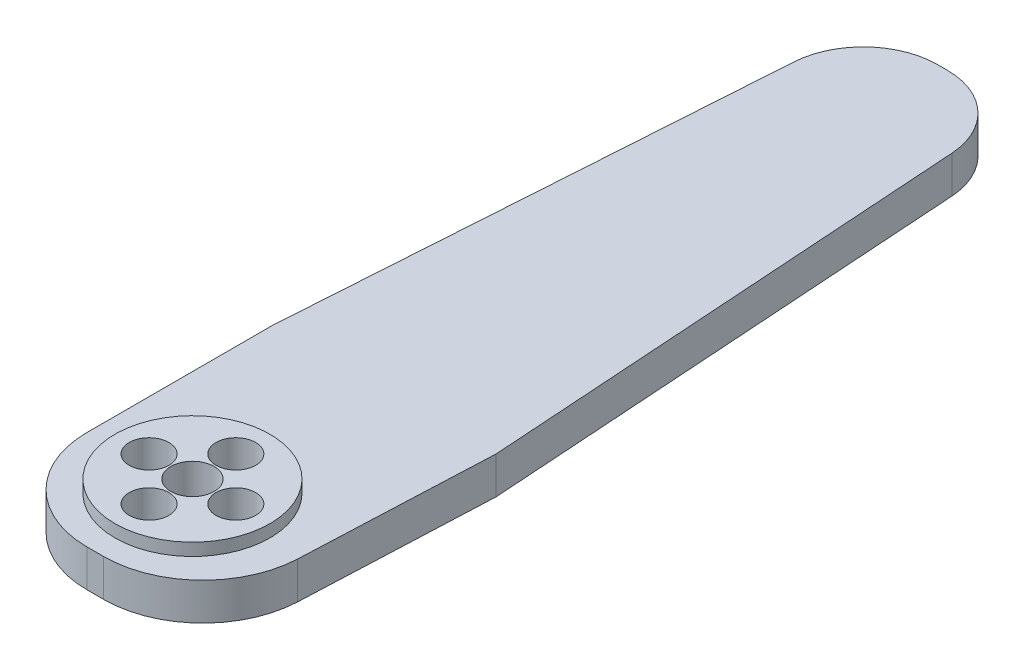
ISO-10303-21;
HEADER;
FILE_DESCRIPTION(('STEP AP214'),'2;1');
FILE_NAME('part.step','',(''),(''),'','','');
FILE_SCHEMA(('AUTOMOTIVE_DESIGN { 1 0 10303 214 1 1 1 1 }'));
ENDSEC;
DATA;
#1=APPLICATION_CONTEXT('core data for automotive mechanical design processes');
#2=APPLICATION_PROTOCOL_DEFINITION('international standard','automotive_design',2000,#1);
#3=PRODUCT_CONTEXT('',#1,'mechanical');
#4=PRODUCT('Part','Part','',(#3));
#5=PRODUCT_RELATED_PRODUCT_CATEGORY('part','',(#4));
#6=PRODUCT_DEFINITION_FORMATION('','',#4);
#7=PRODUCT_DEFINITION_CONTEXT('part definition',#1,'design');
#8=PRODUCT_DEFINITION('design','',#6,#7);
#9=PRODUCT_DEFINITION_SHAPE('','',#8);
#10=(LENGTH_UNIT() NAMED_UNIT(*) SI_UNIT(.MILLI.,.METRE.));
#11=(NAMED_UNIT(*) PLANE_ANGLE_UNIT() SI_UNIT($,.RADIAN.));
#12=(NAMED_UNIT(*) SI_UNIT($,.STERADIAN.) SOLID_ANGLE_UNIT());
#13=UNCERTAINTY_MEASURE_WITH_UNIT(LENGTH_MEASURE(1.E-05),#10,'distance_accuracy_value','');
#14=(GEOMETRIC_REPRESENTATION_CONTEXT(3) GLOBAL_UNCERTAINTY_ASSIGNED_CONTEXT((#13)) GLOBAL_UNIT_ASSIGNED_CONTEXT((#10,
#11,#12)) REPRESENTATION_CONTEXT('',''));
#15=CARTESIAN_POINT('',(0.,0.,0.));
#16=DIRECTION('',(0.,0.,1.));
#17=DIRECTION('',(1.,0.,0.));
#18=AXIS2_PLACEMENT_3D('',#15,#16,#17);
#19=CARTESIAN_POINT('',(0.,8.1,-7.));
#20=DIRECTION('',(0.,-1.,0.));
#21=DIRECTION('',(0.,0.,-1.));
#22=AXIS2_PLACEMENT_3D('',#19,#20,#21);
#23=CYLINDRICAL_SURFACE('',#22,1.7);
#24=CARTESIAN_POINT('',(0.,0.,-7.));
#25=DIRECTION('',(0.,1.,0.));
#26=DIRECTION('',(0.,0.,1.));
#27=AXIS2_PLACEMENT_3D('',#24,#25,#26);
#28=CIRCLE('',#27,1.7);
#29=CARTESIAN_POINT('',(0.,0.,-5.3));
#30=VERTEX_POINT('',#29);
#31=EDGE_CURVE('E205',#30,#30,#28,.F.);
#32=ORIENTED_EDGE('',*,*,#31,.T.);
#33=EDGE_LOOP('',(#32));
#34=FACE_BOUND('',#33,.T.);
#35=CARTESIAN_POINT('',(0.,3.,-7.));
#36=DIRECTION('',(0.,1.,0.));
#37=DIRECTION('',(0.,0.,1.));
#38=AXIS2_PLACEMENT_3D('',#35,#36,#37);
#39=CIRCLE('',#38,1.7);
#40=CARTESIAN_POINT('',(0.,3.,-5.3));
#41=VERTEX_POINT('',#40);
#42=EDGE_CURVE('E216',#41,#41,#39,.T.);
#43=ORIENTED_EDGE('',*,*,#42,.T.);
#44=EDGE_LOOP('',(#43));
#45=FACE_BOUND('',#44,.T.);
#46=ADVANCED_FACE('F39',(#34,#45),#23,.F.);
#47=CARTESIAN_POINT('',(-7.,8.1,0.));
#48=DIRECTION('',(0.,-1.,0.));
#49=DIRECTION('',(0.,0.,-1.));
#50=AXIS2_PLACEMENT_3D('',#47,#48,#49);
#51=CYLINDRICAL_SURFACE('',#50,1.7);
#52=CARTESIAN_POINT('',(-7.,0.,0.));
#53=DIRECTION('',(0.,1.,0.));
#54=DIRECTION('',(0.,0.,1.));
#55=AXIS2_PLACEMENT_3D('',#52,#53,#54);
#56=CIRCLE('',#55,1.7);
#57=CARTESIAN_POINT('',(-7.,0.,1.7));
#58=VERTEX_POINT('',#57);
#59=EDGE_CURVE('E231',#58,#58,#56,.F.);
#60=ORIENTED_EDGE('',*,*,#59,.T.);
#61=EDGE_LOOP('',(#60));
#62=FACE_BOUND('',#61,.T.);
#63=CARTESIAN_POINT('',(-7.,3.,0.));
#64=DIRECTION('',(0.,1.,0.));
#65=DIRECTION('',(0.,0.,1.));
#66=AXIS2_PLACEMENT_3D('',#63,#64,#65);
#67=CIRCLE('',#66,1.7);
#68=CARTESIAN_POINT('',(-7.,3.,1.7));
#69=VERTEX_POINT('',#68);
#70=EDGE_CURVE('E209',#69,#69,#67,.T.);
#71=ORIENTED_EDGE('',*,*,#70,.T.);
#72=EDGE_LOOP('',(#71));
#73=FACE_BOUND('',#72,.T.);
#74=ADVANCED_FACE('F281',(#62,#73),#51,.F.);
#75=CARTESIAN_POINT('',(0.,8.1,7.));
#76=DIRECTION('',(0.,-1.,0.));
#77=DIRECTION('',(0.,0.,-1.));
#78=AXIS2_PLACEMENT_3D('',#75,#76,#77);
#79=CYLINDRICAL_SURFACE('',#78,1.7);
#80=CARTESIAN_POINT('',(0.,0.,7.));
#81=DIRECTION('',(0.,1.,0.));
#82=DIRECTION('',(0.,0.,1.));
#83=AXIS2_PLACEMENT_3D('',#80,#81,#82);
#84=CIRCLE('',#83,1.7);
#85=CARTESIAN_POINT('',(0.,0.,8.7));
#86=VERTEX_POINT('',#85);
#87=EDGE_CURVE('E236',#86,#86,#84,.F.);
#88=ORIENTED_EDGE('',*,*,#87,.T.);
#89=EDGE_LOOP('',(#88));
#90=FACE_BOUND('',#89,.T.);
#91=CARTESIAN_POINT('',(0.,3.,7.));
#92=DIRECTION('',(0.,1.,0.));
#93=DIRECTION('',(0.,0.,1.));
#94=AXIS2_PLACEMENT_3D('',#91,#92,#93);
#95=CIRCLE('',#94,1.7);
#96=CARTESIAN_POINT('',(0.,3.,8.7));
#97=VERTEX_POINT('',#96);
#98=EDGE_CURVE('E201',#97,#97,#95,.T.);
#99=ORIENTED_EDGE('',*,*,#98,.T.);
#100=EDGE_LOOP('',(#99));
#101=FACE_BOUND('',#100,.T.);
#102=ADVANCED_FACE('F291',(#90,#101),#79,.F.);
#103=CARTESIAN_POINT('',(7.,8.1,0.));
#104=DIRECTION('',(0.,-1.,0.));
#105=DIRECTION('',(0.,0.,-1.));
#106=AXIS2_PLACEMENT_3D('',#103,#104,#105);
#107=CYLINDRICAL_SURFACE('',#106,1.7);
#108=CARTESIAN_POINT('',(7.,0.,0.));
#109=DIRECTION('',(0.,1.,0.));
#110=DIRECTION('',(0.,0.,1.));
#111=AXIS2_PLACEMENT_3D('',#108,#109,#110);
#112=CIRCLE('',#111,1.7);
#113=CARTESIAN_POINT('',(7.,0.,1.7));
#114=VERTEX_POINT('',#113);
#115=EDGE_CURVE('E194',#114,#114,#112,.F.);
#116=ORIENTED_EDGE('',*,*,#115,.T.);
#117=EDGE_LOOP('',(#116));
#118=FACE_BOUND('',#117,.T.);
#119=CARTESIAN_POINT('',(7.,3.,0.));
#120=DIRECTION('',(0.,1.,0.));
#121=DIRECTION('',(0.,0.,1.));
#122=AXIS2_PLACEMENT_3D('',#119,#120,#121);
#123=CIRCLE('',#122,1.7);
#124=CARTESIAN_POINT('',(7.,3.,1.7));
#125=VERTEX_POINT('',#124);
#126=EDGE_CURVE('E191',#125,#125,#123,.T.);
#127=ORIENTED_EDGE('',*,*,#126,.T.);
#128=EDGE_LOOP('',(#127));
#129=FACE_BOUND('',#128,.T.);
#130=ADVANCED_FACE('F305',(#118,#129),#107,.F.);
#131=CARTESIAN_POINT('',(-0.999970982587433,6.,-2.90174125647941E-05));
#132=DIRECTION('',(0.,-1.,0.));
#133=DIRECTION('',(0.,0.,-1.));
#134=AXIS2_PLACEMENT_3D('',#131,#132,#133);
#135=CYLINDRICAL_SURFACE('',#134,16.0000290174389);
#136=CARTESIAN_POINT('',(-0.999970982587433,0.,-2.90174125647941E-05));
#137=DIRECTION('',(0.,1.,0.));
#138=DIRECTION('',(0.,0.,1.));
#139=AXIS2_PLACEMENT_3D('',#136,#137,#138);
#140=CIRCLE('',#139,16.0000290174389);
#141=CARTESIAN_POINT('',(-17.,0.,0.));
#142=VERTEX_POINT('',#141);
#143=CARTESIAN_POINT('',(-1.,0.,16.));
#144=VERTEX_POINT('',#143);
#145=EDGE_CURVE('E151',#142,#144,#140,.T.);
#146=ORIENTED_EDGE('',*,*,#145,.T.);
#147=DIRECTION('',(0.,-1.,0.));
#148=VECTOR('',#147,1.);
#149=CARTESIAN_POINT('',(-1.,6.,16.));
#150=LINE('',#149,#148);
#151=CARTESIAN_POINT('',(-1.,6.,16.));
#152=VERTEX_POINT('',#151);
#153=EDGE_CURVE('E47',#152,#144,#150,.T.);
#154=ORIENTED_EDGE('',*,*,#153,.F.);
#155=CARTESIAN_POINT('',(-0.999970982587433,6.,-2.90174125647941E-05));
#156=DIRECTION('',(0.,1.,0.));
#157=DIRECTION('',(0.,0.,1.));
#158=AXIS2_PLACEMENT_3D('',#155,#156,#157);
#159=CIRCLE('',#158,16.0000290174389);
#160=CARTESIAN_POINT('',(-17.,6.,0.));
#161=VERTEX_POINT('',#160);
#162=EDGE_CURVE('E168',#161,#152,#159,.T.);
#163=ORIENTED_EDGE('',*,*,#162,.F.);
#164=DIRECTION('',(0.,-1.,0.));
#165=VECTOR('',#164,1.);
#166=CARTESIAN_POINT('',(-17.,6.,0.));
#167=LINE('',#166,#165);
#168=EDGE_CURVE('E150',#161,#142,#167,.T.);
#169=ORIENTED_EDGE('',*,*,#168,.T.);
#170=EDGE_LOOP('',(#146,#154,#163,#169));
#171=FACE_BOUND('',#170,.T.);
#172=ADVANCED_FACE('F41',(#171),#135,.T.);
#173=CARTESIAN_POINT('',(-1.,6.,16.));
#174=DIRECTION('',(0.,0.,-1.));
#175=DIRECTION('',(-1.,0.,0.));
#176=AXIS2_PLACEMENT_3D('',#173,#174,#175);
#177=PLANE('',#176);
#178=DIRECTION('',(1.,0.,0.));
#179=VECTOR('',#178,1.);
#180=CARTESIAN_POINT('',(-1.,0.,16.));
#181=LINE('',#180,#179);
#182=CARTESIAN_POINT('',(1.68049999999999,0.,16.));
#183=VERTEX_POINT('',#182);
#184=EDGE_CURVE('E152',#144,#183,#181,.T.);
#185=ORIENTED_EDGE('',*,*,#184,.T.);
#186=DIRECTION('',(0.,-1.,0.));
#187=VECTOR('',#186,1.);
#188=CARTESIAN_POINT('',(1.68049999999999,6.,16.));
#189=LINE('',#188,#187);
#190=CARTESIAN_POINT('',(1.68049999999999,6.,16.));
#191=VERTEX_POINT('',#190);
#192=EDGE_CURVE('E187',#191,#183,#189,.T.);
#193=ORIENTED_EDGE('',*,*,#192,.F.);
#194=DIRECTION('',(1.,0.,0.));
#195=VECTOR('',#194,1.);
#196=CARTESIAN_POINT('',(-1.,6.,16.));
#197=LINE('',#196,#195);
#198=EDGE_CURVE('E107',#152,#191,#197,.T.);
#199=ORIENTED_EDGE('',*,*,#198,.F.);
#200=ORIENTED_EDGE('',*,*,#153,.T.);
#201=EDGE_LOOP('',(#185,#193,#199,#200));
#202=FACE_BOUND('',#201,.T.);
#203=ADVANCED_FACE('F524',(#202),#177,.F.);
#204=CARTESIAN_POINT('',(1.68053696198408,6.,3.68721737500216E-05));
#205=DIRECTION('',(0.,-1.,0.));
#206=DIRECTION('',(0.,0.,-1.));
#207=AXIS2_PLACEMENT_3D('',#204,#205,#206);
#208=CYLINDRICAL_SURFACE('',#207,15.9999631278689);
#209=CARTESIAN_POINT('',(1.68053696198408,0.,3.68721737500216E-05));
#210=DIRECTION('',(0.,1.,0.));
#211=DIRECTION('',(0.,0.,1.));
#212=AXIS2_PLACEMENT_3D('',#209,#210,#211);
#213=CIRCLE('',#212,15.9999631278689);
#214=CARTESIAN_POINT('',(17.6654,0.,0.695));
#215=VERTEX_POINT('',#214);
#216=EDGE_CURVE('E160',#183,#215,#213,.T.);
#217=ORIENTED_EDGE('',*,*,#216,.T.);
#218=DIRECTION('',(0.,-1.,0.));
#219=VECTOR('',#218,1.);
#220=CARTESIAN_POINT('',(17.6654,6.,0.695));
#221=LINE('',#220,#219);
#222=CARTESIAN_POINT('',(17.6654,6.,0.695));
#223=VERTEX_POINT('',#222);
#224=EDGE_CURVE('E181',#223,#215,#221,.T.);
#225=ORIENTED_EDGE('',*,*,#224,.F.);
#226=CARTESIAN_POINT('',(1.68053696198408,6.,3.68721737500216E-05));
#227=DIRECTION('',(0.,1.,0.));
#228=DIRECTION('',(0.,0.,1.));
#229=AXIS2_PLACEMENT_3D('',#226,#227,#228);
#230=CIRCLE('',#229,15.9999631278689);
#231=EDGE_CURVE('E249',#191,#223,#230,.T.);
#232=ORIENTED_EDGE('',*,*,#231,.F.);
#233=ORIENTED_EDGE('',*,*,#192,.T.);
#234=EDGE_LOOP('',(#217,#225,#232,#233));
#235=FACE_BOUND('',#234,.T.);
#236=ADVANCED_FACE('F514',(#235),#208,.T.);
#237=CARTESIAN_POINT('',(17.6654,6.,0.695));
#238=DIRECTION('',(-0.999056109225598,0.,-0.0434383542392077));
#239=DIRECTION('',(-0.0434383542392077,0.,0.999056109225598));
#240=AXIS2_PLACEMENT_3D('',#237,#238,#239);
#241=PLANE('',#240);
#242=DIRECTION('',(0.0434383542392077,0.,-0.999056109225598));
#243=VECTOR('',#242,1.);
#244=CARTESIAN_POINT('',(17.6654,0.,0.695));
#245=LINE('',#244,#243);
#246=CARTESIAN_POINT('',(19.,0.,-30.));
#247=VERTEX_POINT('',#246);
#248=EDGE_CURVE('E157',#215,#247,#245,.T.);
#249=ORIENTED_EDGE('',*,*,#248,.T.);
#250=DIRECTION('',(0.,-1.,0.));
#251=VECTOR('',#250,1.);
#252=CARTESIAN_POINT('',(19.,6.,-30.));
#253=LINE('',#252,#251);
#254=CARTESIAN_POINT('',(19.,6.,-30.));
#255=VERTEX_POINT('',#254);
#256=EDGE_CURVE('E176',#255,#247,#253,.T.);
#257=ORIENTED_EDGE('',*,*,#256,.F.);
#258=DIRECTION('',(0.0434383542392077,0.,-0.999056109225598));
#259=VECTOR('',#258,1.);
#260=CARTESIAN_POINT('',(17.6654,6.,0.695));
#261=LINE('',#260,#259);
#262=EDGE_CURVE('E253',#223,#255,#261,.T.);
#263=ORIENTED_EDGE('',*,*,#262,.F.);
#264=ORIENTED_EDGE('',*,*,#224,.T.);
#265=EDGE_LOOP('',(#249,#257,#263,#264));
#266=FACE_BOUND('',#265,.T.);
#267=ADVANCED_FACE('F504',(#266),#241,.F.);
#268=CARTESIAN_POINT('',(19.,6.,-30.));
#269=DIRECTION('',(-0.99778516906238,0.,0.0665188424369909));
#270=DIRECTION('',(0.0665188424369909,0.,0.99778516906238));
#271=AXIS2_PLACEMENT_3D('',#268,#269,#270);
#272=PLANE('',#271);
#273=DIRECTION('',(-0.0665188424369909,0.,-0.99778516906238));
#274=VECTOR('',#273,1.);
#275=CARTESIAN_POINT('',(19.,0.,-30.));
#276=LINE('',#275,#274);
#277=CARTESIAN_POINT('',(13.7468,0.,-108.7982));
#278=VERTEX_POINT('',#277);
#279=EDGE_CURVE('E161',#247,#278,#276,.T.);
#280=ORIENTED_EDGE('',*,*,#279,.T.);
#281=DIRECTION('',(0.,-1.,0.));
#282=VECTOR('',#281,1.);
#283=CARTESIAN_POINT('',(13.7468,6.,-108.7982));
#284=LINE('',#283,#282);
#285=CARTESIAN_POINT('',(13.7468,6.,-108.7982));
#286=VERTEX_POINT('',#285);
#287=EDGE_CURVE('E180',#286,#278,#284,.T.);
#288=ORIENTED_EDGE('',*,*,#287,.F.);
#289=DIRECTION('',(-0.0665188424369909,0.,-0.99778516906238));
#290=VECTOR('',#289,1.);
#291=CARTESIAN_POINT('',(19.,6.,-30.));
#292=LINE('',#291,#290);
#293=EDGE_CURVE('E251',#255,#286,#292,.T.);
#294=ORIENTED_EDGE('',*,*,#293,.F.);
#295=ORIENTED_EDGE('',*,*,#256,.T.);
#296=EDGE_LOOP('',(#280,#288,#294,#295));
#297=FACE_BOUND('',#296,.T.);
#298=ADVANCED_FACE('F494',(#297),#272,.F.);
#299=CARTESIAN_POINT('',(1.77348618435461,6.,-108.000117527518));
#300=DIRECTION('',(0.,-1.,0.));
#301=DIRECTION('',(0.,0.,-1.));
#302=AXIS2_PLACEMENT_3D('',#299,#300,#301);
#303=CYLINDRICAL_SURFACE('',#302,11.9998824727915);
#304=CARTESIAN_POINT('',(1.77348618435461,0.,-108.000117527518));
#305=DIRECTION('',(0.,1.,0.));
#306=DIRECTION('',(0.,0.,1.));
#307=AXIS2_PLACEMENT_3D('',#304,#305,#306);
#308=CIRCLE('',#307,11.9998824727915);
#309=CARTESIAN_POINT('',(1.7734,0.,-120.));
#310=VERTEX_POINT('',#309);
#311=EDGE_CURVE('E162',#278,#310,#308,.T.);
#312=ORIENTED_EDGE('',*,*,#311,.T.);
#313=DIRECTION('',(0.,-1.,0.));
#314=VECTOR('',#313,1.);
#315=CARTESIAN_POINT('',(1.7734,6.,-120.));
#316=LINE('',#315,#314);
#317=CARTESIAN_POINT('',(1.7734,6.,-120.));
#318=VERTEX_POINT('',#317);
#319=EDGE_CURVE('E174',#318,#310,#316,.T.);
#320=ORIENTED_EDGE('',*,*,#319,.F.);
#321=CARTESIAN_POINT('',(1.77348618435461,6.,-108.000117527518));
#322=DIRECTION('',(0.,1.,0.));
#323=DIRECTION('',(0.,0.,1.));
#324=AXIS2_PLACEMENT_3D('',#321,#322,#323);
#325=CIRCLE('',#324,11.9998824727915);
#326=EDGE_CURVE('E254',#286,#318,#325,.T.);
#327=ORIENTED_EDGE('',*,*,#326,.F.);
#328=ORIENTED_EDGE('',*,*,#287,.T.);
#329=EDGE_LOOP('',(#312,#320,#327,#328));
#330=FACE_BOUND('',#329,.T.);
#331=ADVANCED_FACE('F261',(#330),#303,.T.);
#332=CARTESIAN_POINT('',(1.7734,6.,-120.));
#333=DIRECTION('',(0.,0.,1.));
#334=DIRECTION('',(1.,0.,0.));
#335=AXIS2_PLACEMENT_3D('',#332,#333,#334);
#336=PLANE('',#335);
#337=DIRECTION('',(-1.,0.,0.));
#338=VECTOR('',#337,1.);
#339=CARTESIAN_POINT('',(1.7734,0.,-120.));
#340=LINE('',#339,#338);
#341=CARTESIAN_POINT('',(0.226599999999998,0.,-120.));
#342=VERTEX_POINT('',#341);
#343=EDGE_CURVE('E164',#310,#342,#340,.T.);
#344=ORIENTED_EDGE('',*,*,#343,.T.);
#345=DIRECTION('',(0.,-1.,0.));
#346=VECTOR('',#345,1.);
#347=CARTESIAN_POINT('',(0.226599999999998,6.,-120.));
#348=LINE('',#347,#346);
#349=CARTESIAN_POINT('',(0.226599999999998,6.,-120.));
#350=VERTEX_POINT('',#349);
#351=EDGE_CURVE('E142',#350,#342,#348,.T.);
#352=ORIENTED_EDGE('',*,*,#351,.F.);
#353=DIRECTION('',(-1.,0.,0.));
#354=VECTOR('',#353,1.);
#355=CARTESIAN_POINT('',(1.7734,6.,-120.));
#356=LINE('',#355,#354);
#357=EDGE_CURVE('E133',#318,#350,#356,.T.);
#358=ORIENTED_EDGE('',*,*,#357,.F.);
#359=ORIENTED_EDGE('',*,*,#319,.T.);
#360=EDGE_LOOP('',(#344,#352,#358,#359));
#361=FACE_BOUND('',#360,.T.);
#362=ADVANCED_FACE('F264',(#361),#336,.F.);
#363=CARTESIAN_POINT('',(0.226513815645389,6.,-108.000117527518));
#364=DIRECTION('',(0.,-1.,0.));
#365=DIRECTION('',(0.,0.,-1.));
#366=AXIS2_PLACEMENT_3D('',#363,#364,#365);
#367=CYLINDRICAL_SURFACE('',#366,11.9998824727915);
#368=CARTESIAN_POINT('',(0.226513815645389,0.,-108.000117527518));
#369=DIRECTION('',(0.,1.,0.));
#370=DIRECTION('',(0.,0.,1.));
#371=AXIS2_PLACEMENT_3D('',#368,#369,#370);
#372=CIRCLE('',#371,11.9998824727915);
#373=CARTESIAN_POINT('',(-11.7468,0.,-108.7982));
#374=VERTEX_POINT('',#373);
#375=EDGE_CURVE('E143',#342,#374,#372,.T.);
#376=ORIENTED_EDGE('',*,*,#375,.T.);
#377=DIRECTION('',(0.,-1.,0.));
#378=VECTOR('',#377,1.);
#379=CARTESIAN_POINT('',(-11.7468,6.,-108.7982));
#380=LINE('',#379,#378);
#381=CARTESIAN_POINT('',(-11.7468,6.,-108.7982));
#382=VERTEX_POINT('',#381);
#383=EDGE_CURVE('E138',#382,#374,#380,.T.);
#384=ORIENTED_EDGE('',*,*,#383,.F.);
#385=CARTESIAN_POINT('',(0.226513815645389,6.,-108.000117527518));
#386=DIRECTION('',(0.,1.,0.));
#387=DIRECTION('',(0.,0.,1.));
#388=AXIS2_PLACEMENT_3D('',#385,#386,#387);
#389=CIRCLE('',#388,11.9998824727915);
#390=EDGE_CURVE('E130',#350,#382,#389,.T.);
#391=ORIENTED_EDGE('',*,*,#390,.F.);
#392=ORIENTED_EDGE('',*,*,#351,.T.);
#393=EDGE_LOOP('',(#376,#384,#391,#392));
#394=FACE_BOUND('',#393,.T.);
#395=ADVANCED_FACE('F139',(#394),#367,.T.);
#396=CARTESIAN_POINT('',(-11.7468,6.,-108.7982));
#397=DIRECTION('',(0.99778516906238,0.,0.0665188424369909));
#398=DIRECTION('',(0.0665188424369909,0.,-0.99778516906238));
#399=AXIS2_PLACEMENT_3D('',#396,#397,#398);
#400=PLANE('',#399);
#401=DIRECTION('',(-0.0665188424369909,0.,0.99778516906238));
#402=VECTOR('',#401,1.);
#403=CARTESIAN_POINT('',(-11.7468,0.,-108.7982));
#404=LINE('',#403,#402);
#405=CARTESIAN_POINT('',(-17.,0.,-30.));
#406=VERTEX_POINT('',#405);
#407=EDGE_CURVE('E91',#374,#406,#404,.T.);
#408=ORIENTED_EDGE('',*,*,#407,.T.);
#409=DIRECTION('',(0.,-1.,0.));
#410=VECTOR('',#409,1.);
#411=CARTESIAN_POINT('',(-17.,6.,-30.));
#412=LINE('',#411,#410);
#413=CARTESIAN_POINT('',(-17.,6.,-30.));
#414=VERTEX_POINT('',#413);
#415=EDGE_CURVE('E141',#414,#406,#412,.T.);
#416=ORIENTED_EDGE('',*,*,#415,.F.);
#417=DIRECTION('',(-0.0665188424369909,0.,0.99778516906238));
#418=VECTOR('',#417,1.);
#419=CARTESIAN_POINT('',(-11.7468,6.,-108.7982));
#420=LINE('',#419,#418);
#421=EDGE_CURVE('E132',#382,#414,#420,.T.);
#422=ORIENTED_EDGE('',*,*,#421,.F.);
#423=ORIENTED_EDGE('',*,*,#383,.T.);
#424=EDGE_LOOP('',(#408,#416,#422,#423));
#425=FACE_BOUND('',#424,.T.);
#426=ADVANCED_FACE('F144',(#425),#400,.F.);
#427=CARTESIAN_POINT('',(-17.,6.,-30.));
#428=DIRECTION('',(1.,0.,0.));
#429=DIRECTION('',(0.,0.,-1.));
#430=AXIS2_PLACEMENT_3D('',#427,#428,#429);
#431=PLANE('',#430);
#432=DIRECTION('',(0.,0.,1.));
#433=VECTOR('',#432,1.);
#434=CARTESIAN_POINT('',(-17.,0.,-30.));
#435=LINE('',#434,#433);
#436=EDGE_CURVE('E97',#406,#142,#435,.T.);
#437=ORIENTED_EDGE('',*,*,#436,.T.);
#438=ORIENTED_EDGE('',*,*,#168,.F.);
#439=DIRECTION('',(0.,0.,1.));
#440=VECTOR('',#439,1.);
#441=CARTESIAN_POINT('',(-17.,6.,-30.));
#442=LINE('',#441,#440);
#443=EDGE_CURVE('E59',#414,#161,#442,.T.);
#444=ORIENTED_EDGE('',*,*,#443,.F.);
#445=ORIENTED_EDGE('',*,*,#415,.T.);
#446=EDGE_LOOP('',(#437,#438,#444,#445));
#447=FACE_BOUND('',#446,.T.);
#448=ADVANCED_FACE('F272',(#447),#431,.F.);
#449=CARTESIAN_POINT('',(-0.999970982587433,6.,-2.90174125647941E-05));
#450=DIRECTION('',(0.,1.,0.));
#451=DIRECTION('',(0.,0.,1.));
#452=AXIS2_PLACEMENT_3D('',#449,#450,#451);
#453=PLANE('',#452);
#454=CARTESIAN_POINT('',(0.,6.,0.));
#455=DIRECTION('',(0.,1.,0.));
#456=DIRECTION('',(0.,0.,1.));
#457=AXIS2_PLACEMENT_3D('',#454,#455,#456);
#458=CIRCLE('',#457,12.5);
#459=CARTESIAN_POINT('',(0.,6.,12.5));
#460=VERTEX_POINT('',#459);
#461=EDGE_CURVE('E11',#460,#460,#458,.T.);
#462=ORIENTED_EDGE('',*,*,#461,.F.);
#463=EDGE_LOOP('',(#462));
#464=FACE_BOUND('',#463,.T.);
#465=ORIENTED_EDGE('',*,*,#162,.T.);
#466=ORIENTED_EDGE('',*,*,#198,.T.);
#467=ORIENTED_EDGE('',*,*,#231,.T.);
#468=ORIENTED_EDGE('',*,*,#262,.T.);
#469=ORIENTED_EDGE('',*,*,#293,.T.);
#470=ORIENTED_EDGE('',*,*,#326,.T.);
#471=ORIENTED_EDGE('',*,*,#357,.T.);
#472=ORIENTED_EDGE('',*,*,#390,.T.);
#473=ORIENTED_EDGE('',*,*,#421,.T.);
#474=ORIENTED_EDGE('',*,*,#443,.T.);
#475=EDGE_LOOP('',(#465,#466,#467,#468,#469,#470,#471,#472,#473,#474));
#476=FACE_BOUND('',#475,.T.);
#477=ADVANCED_FACE('F129',(#464,#476),#453,.T.);
#478=CARTESIAN_POINT('',(-0.999970982587433,0.,-2.90174125647941E-05));
#479=DIRECTION('',(0.,1.,0.));
#480=DIRECTION('',(0.,0.,1.));
#481=AXIS2_PLACEMENT_3D('',#478,#479,#480);
#482=PLANE('',#481);
#483=ORIENTED_EDGE('',*,*,#31,.F.);
#484=EDGE_LOOP('',(#483));
#485=FACE_BOUND('',#484,.T.);
#486=ORIENTED_EDGE('',*,*,#59,.F.);
#487=EDGE_LOOP('',(#486));
#488=FACE_BOUND('',#487,.T.);
#489=ORIENTED_EDGE('',*,*,#87,.F.);
#490=EDGE_LOOP('',(#489));
#491=FACE_BOUND('',#490,.T.);
#492=ORIENTED_EDGE('',*,*,#115,.F.);
#493=EDGE_LOOP('',(#492));
#494=FACE_BOUND('',#493,.T.);
#495=CARTESIAN_POINT('',(0.,0.,0.));
#496=DIRECTION('',(0.,1.,0.));
#497=DIRECTION('',(0.,0.,1.));
#498=AXIS2_PLACEMENT_3D('',#495,#496,#497);
#499=CIRCLE('',#498,3.5);
#500=CARTESIAN_POINT('',(0.,0.,3.5));
#501=VERTEX_POINT('',#500);
#502=EDGE_CURVE('E193',#501,#501,#499,.F.);
#503=ORIENTED_EDGE('',*,*,#502,.F.);
#504=EDGE_LOOP('',(#503));
#505=FACE_BOUND('',#504,.T.);
#506=ORIENTED_EDGE('',*,*,#145,.F.);
#507=ORIENTED_EDGE('',*,*,#436,.F.);
#508=ORIENTED_EDGE('',*,*,#407,.F.);
#509=ORIENTED_EDGE('',*,*,#375,.F.);
#510=ORIENTED_EDGE('',*,*,#343,.F.);
#511=ORIENTED_EDGE('',*,*,#311,.F.);
#512=ORIENTED_EDGE('',*,*,#279,.F.);
#513=ORIENTED_EDGE('',*,*,#248,.F.);
#514=ORIENTED_EDGE('',*,*,#216,.F.);
#515=ORIENTED_EDGE('',*,*,#184,.F.);
#516=EDGE_LOOP('',(#506,#507,#508,#509,#510,#511,#512,#513,#514,#515));
#517=FACE_BOUND('',#516,.T.);
#518=ADVANCED_FACE('F268',(#485,#488,#491,#494,#505,#517),#482,.F.);
#519=CARTESIAN_POINT('',(0.,8.,0.));
#520=DIRECTION('',(0.,-1.,0.));
#521=DIRECTION('',(0.,0.,-1.));
#522=AXIS2_PLACEMENT_3D('',#519,#520,#521);
#523=CYLINDRICAL_SURFACE('',#522,12.5);
#524=CARTESIAN_POINT('',(0.,8.,0.));
#525=DIRECTION('',(0.,1.,0.));
#526=DIRECTION('',(0.,0.,1.));
#527=AXIS2_PLACEMENT_3D('',#524,#525,#526);
#528=CIRCLE('',#527,12.5);
#529=CARTESIAN_POINT('',(0.,8.,12.5));
#530=VERTEX_POINT('',#529);
#531=EDGE_CURVE('E154',#530,#530,#528,.T.);
#532=ORIENTED_EDGE('',*,*,#531,.F.);
#533=EDGE_LOOP('',(#532));
#534=FACE_BOUND('',#533,.T.);
#535=ORIENTED_EDGE('',*,*,#461,.T.);
#536=EDGE_LOOP('',(#535));
#537=FACE_BOUND('',#536,.T.);
#538=ADVANCED_FACE('F311',(#534,#537),#523,.T.);
#539=CARTESIAN_POINT('',(0.,8.,0.));
#540=DIRECTION('',(0.,1.,0.));
#541=DIRECTION('',(0.,0.,1.));
#542=AXIS2_PLACEMENT_3D('',#539,#540,#541);
#543=PLANE('',#542);
#544=CARTESIAN_POINT('',(0.,8.,-7.));
#545=DIRECTION('',(0.,1.,0.));
#546=DIRECTION('',(0.,0.,1.));
#547=AXIS2_PLACEMENT_3D('',#544,#545,#546);
#548=CIRCLE('',#547,3.2);
#549=CARTESIAN_POINT('',(0.,8.,-3.8));
#550=VERTEX_POINT('',#549);
#551=EDGE_CURVE('E43',#550,#550,#548,.F.);
#552=ORIENTED_EDGE('',*,*,#551,.T.);
#553=EDGE_LOOP('',(#552));
#554=FACE_BOUND('',#553,.T.);
#555=CARTESIAN_POINT('',(-7.,8.,0.));
#556=DIRECTION('',(0.,1.,0.));
#557=DIRECTION('',(0.,0.,1.));
#558=AXIS2_PLACEMENT_3D('',#555,#556,#557);
#559=CIRCLE('',#558,3.2);
#560=CARTESIAN_POINT('',(-7.,8.,3.2));
#561=VERTEX_POINT('',#560);
#562=EDGE_CURVE('E213',#561,#561,#559,.F.);
#563=ORIENTED_EDGE('',*,*,#562,.T.);
#564=EDGE_LOOP('',(#563));
#565=FACE_BOUND('',#564,.T.);
#566=CARTESIAN_POINT('',(0.,8.,7.));
#567=DIRECTION('',(0.,1.,0.));
#568=DIRECTION('',(0.,0.,1.));
#569=AXIS2_PLACEMENT_3D('',#566,#567,#568);
#570=CIRCLE('',#569,3.2);
#571=CARTESIAN_POINT('',(0.,8.,10.2));
#572=VERTEX_POINT('',#571);
#573=EDGE_CURVE('E206',#572,#572,#570,.F.);
#574=ORIENTED_EDGE('',*,*,#573,.T.);
#575=EDGE_LOOP('',(#574));
#576=FACE_BOUND('',#575,.T.);
#577=CARTESIAN_POINT('',(7.,8.,0.));
#578=DIRECTION('',(0.,1.,0.));
#579=DIRECTION('',(0.,0.,1.));
#580=AXIS2_PLACEMENT_3D('',#577,#578,#579);
#581=CIRCLE('',#580,3.2);
#582=CARTESIAN_POINT('',(7.,8.,3.2));
#583=VERTEX_POINT('',#582);
#584=EDGE_CURVE('E196',#583,#583,#581,.F.);
#585=ORIENTED_EDGE('',*,*,#584,.T.);
#586=EDGE_LOOP('',(#585));
#587=FACE_BOUND('',#586,.T.);
#588=CARTESIAN_POINT('',(0.,8.,0.));
#589=DIRECTION('',(0.,1.,0.));
#590=DIRECTION('',(0.,0.,1.));
#591=AXIS2_PLACEMENT_3D('',#588,#589,#590);
#592=CIRCLE('',#591,3.5);
#593=CARTESIAN_POINT('',(0.,8.,3.5));
#594=VERTEX_POINT('',#593);
#595=EDGE_CURVE('E186',#594,#594,#592,.F.);
#596=ORIENTED_EDGE('',*,*,#595,.T.);
#597=EDGE_LOOP('',(#596));
#598=FACE_BOUND('',#597,.T.);
#599=ORIENTED_EDGE('',*,*,#531,.T.);
#600=EDGE_LOOP('',(#599));
#601=FACE_BOUND('',#600,.T.);
#602=ADVANCED_FACE('F309',(#554,#565,#576,#587,#598,#601),#543,.T.);
#603=CARTESIAN_POINT('',(0.,8.1,0.));
#604=DIRECTION('',(0.,-1.,0.));
#605=DIRECTION('',(0.,0.,-1.));
#606=AXIS2_PLACEMENT_3D('',#603,#604,#605);
#607=CYLINDRICAL_SURFACE('',#606,3.5);
#608=ORIENTED_EDGE('',*,*,#595,.F.);
#609=EDGE_LOOP('',(#608));
#610=FACE_BOUND('',#609,.T.);
#611=ORIENTED_EDGE('',*,*,#502,.T.);
#612=EDGE_LOOP('',(#611));
#613=FACE_BOUND('',#612,.T.);
#614=ADVANCED_FACE('F307',(#610,#613),#607,.F.);
#615=CARTESIAN_POINT('',(7.,8.1,0.));
#616=DIRECTION('',(0.,-1.,0.));
#617=DIRECTION('',(0.,0.,-1.));
#618=AXIS2_PLACEMENT_3D('',#615,#616,#617);
#619=CYLINDRICAL_SURFACE('',#618,3.2);
#620=ORIENTED_EDGE('',*,*,#584,.F.);
#621=EDGE_LOOP('',(#620));
#622=FACE_BOUND('',#621,.T.);
#623=CARTESIAN_POINT('',(7.,3.,0.));
#624=DIRECTION('',(0.,1.,0.));
#625=DIRECTION('',(0.,0.,1.));
#626=AXIS2_PLACEMENT_3D('',#623,#624,#625);
#627=CIRCLE('',#626,3.2);
#628=CARTESIAN_POINT('',(7.,3.,3.2));
#629=VERTEX_POINT('',#628);
#630=EDGE_CURVE('E200',#629,#629,#627,.T.);
#631=ORIENTED_EDGE('',*,*,#630,.F.);
#632=EDGE_LOOP('',(#631));
#633=FACE_BOUND('',#632,.T.);
#634=ADVANCED_FACE('F300',(#622,#633),#619,.F.);
#635=CARTESIAN_POINT('',(7.,3.,0.));
#636=DIRECTION('',(0.,1.,0.));
#637=DIRECTION('',(0.,0.,1.));
#638=AXIS2_PLACEMENT_3D('',#635,#636,#637);
#639=PLANE('',#638);
#640=ORIENTED_EDGE('',*,*,#126,.F.);
#641=EDGE_LOOP('',(#640));
#642=FACE_BOUND('',#641,.T.);
#643=ORIENTED_EDGE('',*,*,#630,.T.);
#644=EDGE_LOOP('',(#643));
#645=FACE_BOUND('',#644,.T.);
#646=ADVANCED_FACE('F331',(#642,#645),#639,.T.);
#647=CARTESIAN_POINT('',(0.,8.1,7.));
#648=DIRECTION('',(0.,-1.,0.));
#649=DIRECTION('',(0.,0.,-1.));
#650=AXIS2_PLACEMENT_3D('',#647,#648,#649);
#651=CYLINDRICAL_SURFACE('',#650,3.2);
#652=ORIENTED_EDGE('',*,*,#573,.F.);
#653=EDGE_LOOP('',(#652));
#654=FACE_BOUND('',#653,.T.);
#655=CARTESIAN_POINT('',(0.,3.,7.));
#656=DIRECTION('',(0.,1.,0.));
#657=DIRECTION('',(0.,0.,1.));
#658=AXIS2_PLACEMENT_3D('',#655,#656,#657);
#659=CIRCLE('',#658,3.2);
#660=CARTESIAN_POINT('',(0.,3.,10.2));
#661=VERTEX_POINT('',#660);
#662=EDGE_CURVE('E210',#661,#661,#659,.T.);
#663=ORIENTED_EDGE('',*,*,#662,.F.);
#664=EDGE_LOOP('',(#663));
#665=FACE_BOUND('',#664,.T.);
#666=ADVANCED_FACE('F340',(#654,#665),#651,.F.);
#667=CARTESIAN_POINT('',(0.,3.,7.));
#668=DIRECTION('',(0.,1.,0.));
#669=DIRECTION('',(0.,0.,1.));
#670=AXIS2_PLACEMENT_3D('',#667,#668,#669);
#671=PLANE('',#670);
#672=ORIENTED_EDGE('',*,*,#98,.F.);
#673=EDGE_LOOP('',(#672));
#674=FACE_BOUND('',#673,.T.);
#675=ORIENTED_EDGE('',*,*,#662,.T.);
#676=EDGE_LOOP('',(#675));
#677=FACE_BOUND('',#676,.T.);
#678=ADVANCED_FACE('F375',(#674,#677),#671,.T.);
#679=CARTESIAN_POINT('',(-7.,8.1,0.));
#680=DIRECTION('',(0.,-1.,0.));
#681=DIRECTION('',(0.,0.,-1.));
#682=AXIS2_PLACEMENT_3D('',#679,#680,#681);
#683=CYLINDRICAL_SURFACE('',#682,3.2);
#684=ORIENTED_EDGE('',*,*,#562,.F.);
#685=EDGE_LOOP('',(#684));
#686=FACE_BOUND('',#685,.T.);
#687=CARTESIAN_POINT('',(-7.,3.,0.));
#688=DIRECTION('',(0.,1.,0.));
#689=DIRECTION('',(0.,0.,1.));
#690=AXIS2_PLACEMENT_3D('',#687,#688,#689);
#691=CIRCLE('',#690,3.2);
#692=CARTESIAN_POINT('',(-7.,3.,3.2));
#693=VERTEX_POINT('',#692);
#694=EDGE_CURVE('E212',#693,#693,#691,.T.);
#695=ORIENTED_EDGE('',*,*,#694,.F.);
#696=EDGE_LOOP('',(#695));
#697=FACE_BOUND('',#696,.T.);
#698=ADVANCED_FACE('F377',(#686,#697),#683,.F.);
#699=CARTESIAN_POINT('',(-7.,3.,0.));
#700=DIRECTION('',(0.,1.,0.));
#701=DIRECTION('',(0.,0.,1.));
#702=AXIS2_PLACEMENT_3D('',#699,#700,#701);
#703=PLANE('',#702);
#704=ORIENTED_EDGE('',*,*,#70,.F.);
#705=EDGE_LOOP('',(#704));
#706=FACE_BOUND('',#705,.T.);
#707=ORIENTED_EDGE('',*,*,#694,.T.);
#708=EDGE_LOOP('',(#707));
#709=FACE_BOUND('',#708,.T.);
#710=ADVANCED_FACE('F393',(#706,#709),#703,.T.);
#711=CARTESIAN_POINT('',(0.,8.1,-7.));
#712=DIRECTION('',(0.,-1.,0.));
#713=DIRECTION('',(0.,0.,-1.));
#714=AXIS2_PLACEMENT_3D('',#711,#712,#713);
#715=CYLINDRICAL_SURFACE('',#714,3.2);
#716=ORIENTED_EDGE('',*,*,#551,.F.);
#717=EDGE_LOOP('',(#716));
#718=FACE_BOUND('',#717,.T.);
#719=CARTESIAN_POINT('',(0.,3.,-7.));
#720=DIRECTION('',(0.,1.,0.));
#721=DIRECTION('',(0.,0.,1.));
#722=AXIS2_PLACEMENT_3D('',#719,#720,#721);
#723=CIRCLE('',#722,3.2);
#724=CARTESIAN_POINT('',(0.,3.,-3.8));
#725=VERTEX_POINT('',#724);
#726=EDGE_CURVE('E217',#725,#725,#723,.T.);
#727=ORIENTED_EDGE('',*,*,#726,.F.);
#728=EDGE_LOOP('',(#727));
#729=FACE_BOUND('',#728,.T.);
#730=ADVANCED_FACE('F396',(#718,#729),#715,.F.);
#731=CARTESIAN_POINT('',(0.,3.,-7.));
#732=DIRECTION('',(0.,1.,0.));
#733=DIRECTION('',(0.,0.,1.));
#734=AXIS2_PLACEMENT_3D('',#731,#732,#733);
#735=PLANE('',#734);
#736=ORIENTED_EDGE('',*,*,#42,.F.);
#737=EDGE_LOOP('',(#736));
#738=FACE_BOUND('',#737,.T.);
#739=ORIENTED_EDGE('',*,*,#726,.T.);
#740=EDGE_LOOP('',(#739));
#741=FACE_BOUND('',#740,.T.);
#742=ADVANCED_FACE('F417',(#738,#741),#735,.T.);
#743=CLOSED_SHELL('',(#46,#74,#102,#130,#172,#203,#236,#267,#298,#331,#362,#395,#426,#448,#477,
#518,#538,#602,#614,#634,#646,#666,#678,#698,#710,#730,#742));
#744=MANIFOLD_SOLID_BREP('B2',#743);
#745=ADVANCED_BREP_SHAPE_REPRESENTATION('',(#18,#744),#14);
#746=SHAPE_DEFINITION_REPRESENTATION(#9,#745);
ENDSEC;
END-ISO-10303-21;
